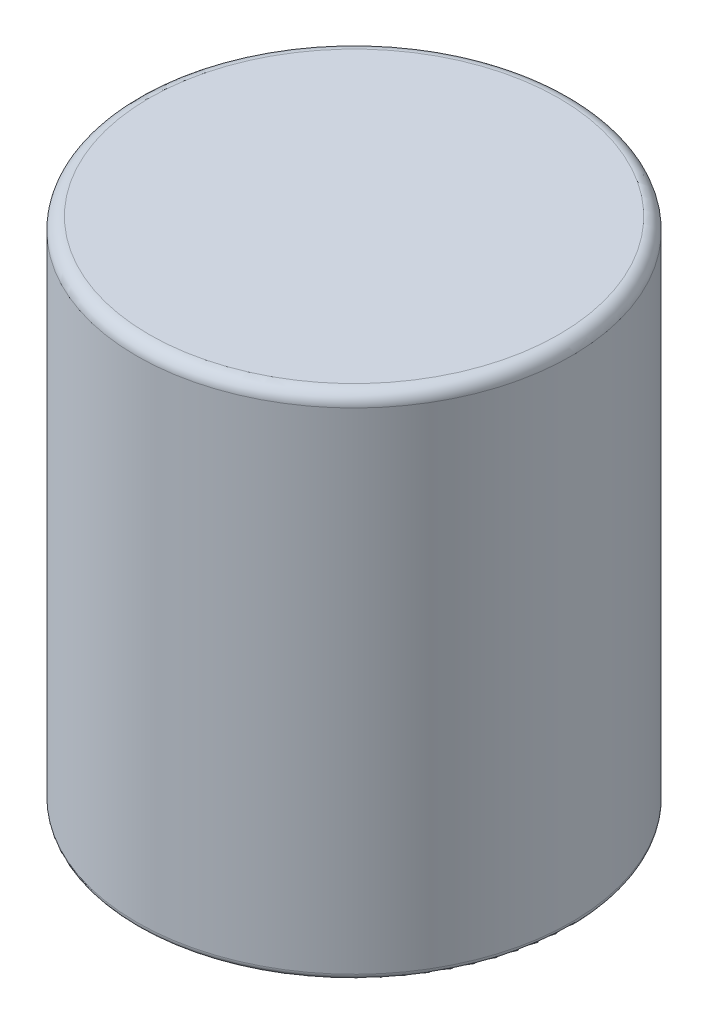
ISO-10303-21;
HEADER;
FILE_DESCRIPTION(('STEP AP214'),'2;1');
FILE_NAME('part.step','',(''),(''),'','','');
FILE_SCHEMA(('AUTOMOTIVE_DESIGN { 1 0 10303 214 1 1 1 1 }'));
ENDSEC;
DATA;
#1=APPLICATION_CONTEXT('core data for automotive mechanical design processes');
#2=APPLICATION_PROTOCOL_DEFINITION('international standard','automotive_design',2000,#1);
#3=PRODUCT_CONTEXT('',#1,'mechanical');
#4=PRODUCT('Part','Part','',(#3));
#5=PRODUCT_RELATED_PRODUCT_CATEGORY('part','',(#4));
#6=PRODUCT_DEFINITION_FORMATION('','',#4);
#7=PRODUCT_DEFINITION_CONTEXT('part definition',#1,'design');
#8=PRODUCT_DEFINITION('design','',#6,#7);
#9=PRODUCT_DEFINITION_SHAPE('','',#8);
#10=(LENGTH_UNIT() NAMED_UNIT(*) SI_UNIT(.MILLI.,.METRE.));
#11=(NAMED_UNIT(*) PLANE_ANGLE_UNIT() SI_UNIT($,.RADIAN.));
#12=(NAMED_UNIT(*) SI_UNIT($,.STERADIAN.) SOLID_ANGLE_UNIT());
#13=UNCERTAINTY_MEASURE_WITH_UNIT(LENGTH_MEASURE(1.E-05),#10,'distance_accuracy_value','');
#14=(GEOMETRIC_REPRESENTATION_CONTEXT(3) GLOBAL_UNCERTAINTY_ASSIGNED_CONTEXT((#13)) GLOBAL_UNIT_ASSIGNED_CONTEXT((#10,
#11,#12)) REPRESENTATION_CONTEXT('',''));
#15=CARTESIAN_POINT('',(0.,0.,0.));
#16=DIRECTION('',(0.,0.,1.));
#17=DIRECTION('',(1.,0.,0.));
#18=AXIS2_PLACEMENT_3D('',#15,#16,#17);
#19=CARTESIAN_POINT('',(0.,41.,0.));
#20=DIRECTION('',(0.,-1.,0.));
#21=DIRECTION('',(0.,0.,-1.));
#22=AXIS2_PLACEMENT_3D('',#19,#20,#21);
#23=CYLINDRICAL_SURFACE('',#22,17.5);
#24=CARTESIAN_POINT('',(0.,0.5,0.));
#25=DIRECTION('',(0.,1.,0.));
#26=DIRECTION('',(0.,0.,1.));
#27=AXIS2_PLACEMENT_3D('',#24,#25,#26);
#28=CIRCLE('',#27,17.5);
#29=CARTESIAN_POINT('',(0.,0.5,17.5));
#30=VERTEX_POINT('',#29);
#31=EDGE_CURVE('E45',#30,#30,#28,.T.);
#32=ORIENTED_EDGE('',*,*,#31,.T.);
#33=EDGE_LOOP('',(#32));
#34=FACE_BOUND('',#33,.T.);
#35=CARTESIAN_POINT('',(0.,40.,0.));
#36=DIRECTION('',(0.,1.,0.));
#37=DIRECTION('',(0.,0.,1.));
#38=AXIS2_PLACEMENT_3D('',#35,#36,#37);
#39=CIRCLE('',#38,17.5);
#40=CARTESIAN_POINT('',(0.,40.,17.5));
#41=VERTEX_POINT('',#40);
#42=EDGE_CURVE('E58',#41,#41,#39,.F.);
#43=ORIENTED_EDGE('',*,*,#42,.T.);
#44=EDGE_LOOP('',(#43));
#45=FACE_BOUND('',#44,.T.);
#46=ADVANCED_FACE('F38',(#34,#45),#23,.T.);
#47=CARTESIAN_POINT('',(0.,41.,0.));
#48=DIRECTION('',(0.,1.,0.));
#49=DIRECTION('',(0.,0.,1.));
#50=AXIS2_PLACEMENT_3D('',#47,#48,#49);
#51=PLANE('',#50);
#52=CARTESIAN_POINT('',(0.,41.,0.));
#53=DIRECTION('',(0.,1.,0.));
#54=DIRECTION('',(0.,0.,1.));
#55=AXIS2_PLACEMENT_3D('',#52,#53,#54);
#56=CIRCLE('',#55,16.5);
#57=CARTESIAN_POINT('',(0.,41.,16.5));
#58=VERTEX_POINT('',#57);
#59=EDGE_CURVE('E61',#58,#58,#56,.T.);
#60=ORIENTED_EDGE('',*,*,#59,.T.);
#61=EDGE_LOOP('',(#60));
#62=FACE_BOUND('',#61,.T.);
#63=ADVANCED_FACE('F84',(#62),#51,.T.);
#64=CARTESIAN_POINT('',(0.,0.,0.));
#65=DIRECTION('',(0.,1.,0.));
#66=DIRECTION('',(0.,0.,1.));
#67=AXIS2_PLACEMENT_3D('',#64,#65,#66);
#68=PLANE('',#67);
#69=CARTESIAN_POINT('',(0.,0.,0.));
#70=DIRECTION('',(0.,1.,0.));
#71=DIRECTION('',(0.,0.,1.));
#72=AXIS2_PLACEMENT_3D('',#69,#70,#71);
#73=CIRCLE('',#72,17.);
#74=CARTESIAN_POINT('',(0.,0.,17.));
#75=VERTEX_POINT('',#74);
#76=EDGE_CURVE('E10',#75,#75,#73,.F.);
#77=ORIENTED_EDGE('',*,*,#76,.T.);
#78=EDGE_LOOP('',(#77));
#79=FACE_BOUND('',#78,.T.);
#80=CARTESIAN_POINT('',(0.,0.,-5.));
#81=DIRECTION('',(0.,1.,0.));
#82=DIRECTION('',(0.,0.,1.));
#83=AXIS2_PLACEMENT_3D('',#80,#81,#82);
#84=CIRCLE('',#83,0.6);
#85=CARTESIAN_POINT('',(0.,0.,-4.4));
#86=VERTEX_POINT('',#85);
#87=EDGE_CURVE('E49',#86,#86,#84,.F.);
#88=ORIENTED_EDGE('',*,*,#87,.F.);
#89=EDGE_LOOP('',(#88));
#90=FACE_BOUND('',#89,.T.);
#91=CARTESIAN_POINT('',(0.,0.,5.));
#92=DIRECTION('',(0.,1.,0.));
#93=DIRECTION('',(0.,0.,1.));
#94=AXIS2_PLACEMENT_3D('',#91,#92,#93);
#95=CIRCLE('',#94,0.6);
#96=CARTESIAN_POINT('',(0.,0.,5.6));
#97=VERTEX_POINT('',#96);
#98=EDGE_CURVE('E53',#97,#97,#95,.F.);
#99=ORIENTED_EDGE('',*,*,#98,.F.);
#100=EDGE_LOOP('',(#99));
#101=FACE_BOUND('',#100,.T.);
#102=ADVANCED_FACE('F80',(#79,#90,#101),#68,.F.);
#103=CARTESIAN_POINT('',(0.,40.,0.));
#104=DIRECTION('',(0.,1.,0.));
#105=DIRECTION('',(0.,0.,1.));
#106=AXIS2_PLACEMENT_3D('',#103,#104,#105);
#107=TOROIDAL_SURFACE('',#106,16.5,1.);
#108=ORIENTED_EDGE('',*,*,#42,.F.);
#109=EDGE_LOOP('',(#108));
#110=FACE_BOUND('',#109,.T.);
#111=ORIENTED_EDGE('',*,*,#59,.F.);
#112=EDGE_LOOP('',(#111));
#113=FACE_BOUND('',#112,.T.);
#114=ADVANCED_FACE('F83',(#110,#113),#107,.T.);
#115=CARTESIAN_POINT('',(0.,-5.,5.));
#116=DIRECTION('',(0.,1.,0.));
#117=DIRECTION('',(0.,0.,1.));
#118=AXIS2_PLACEMENT_3D('',#115,#116,#117);
#119=CYLINDRICAL_SURFACE('',#118,0.6);
#120=CARTESIAN_POINT('',(0.,-5.,5.));
#121=DIRECTION('',(0.,-1.,0.));
#122=DIRECTION('',(0.,0.,-1.));
#123=AXIS2_PLACEMENT_3D('',#120,#121,#122);
#124=CIRCLE('',#123,0.6);
#125=CARTESIAN_POINT('',(0.,-5.,4.4));
#126=VERTEX_POINT('',#125);
#127=EDGE_CURVE('E64',#126,#126,#124,.T.);
#128=ORIENTED_EDGE('',*,*,#127,.F.);
#129=EDGE_LOOP('',(#128));
#130=FACE_BOUND('',#129,.T.);
#131=ORIENTED_EDGE('',*,*,#98,.T.);
#132=EDGE_LOOP('',(#131));
#133=FACE_BOUND('',#132,.T.);
#134=ADVANCED_FACE('F88',(#130,#133),#119,.T.);
#135=CARTESIAN_POINT('',(0.,-5.,5.));
#136=DIRECTION('',(0.,-1.,0.));
#137=DIRECTION('',(0.,0.,-1.));
#138=AXIS2_PLACEMENT_3D('',#135,#136,#137);
#139=PLANE('',#138);
#140=ORIENTED_EDGE('',*,*,#127,.T.);
#141=EDGE_LOOP('',(#140));
#142=FACE_BOUND('',#141,.T.);
#143=ADVANCED_FACE('F76',(#142),#139,.T.);
#144=CARTESIAN_POINT('',(0.,-5.,-5.));
#145=DIRECTION('',(0.,1.,0.));
#146=DIRECTION('',(0.,0.,1.));
#147=AXIS2_PLACEMENT_3D('',#144,#145,#146);
#148=CYLINDRICAL_SURFACE('',#147,0.6);
#149=CARTESIAN_POINT('',(0.,-5.,-5.));
#150=DIRECTION('',(0.,-1.,0.));
#151=DIRECTION('',(0.,0.,-1.));
#152=AXIS2_PLACEMENT_3D('',#149,#150,#151);
#153=CIRCLE('',#152,0.6);
#154=CARTESIAN_POINT('',(0.,-5.,-5.6));
#155=VERTEX_POINT('',#154);
#156=EDGE_CURVE('E67',#155,#155,#153,.T.);
#157=ORIENTED_EDGE('',*,*,#156,.F.);
#158=EDGE_LOOP('',(#157));
#159=FACE_BOUND('',#158,.T.);
#160=ORIENTED_EDGE('',*,*,#87,.T.);
#161=EDGE_LOOP('',(#160));
#162=FACE_BOUND('',#161,.T.);
#163=ADVANCED_FACE('F73',(#159,#162),#148,.T.);
#164=CARTESIAN_POINT('',(0.,-5.,-5.));
#165=DIRECTION('',(0.,-1.,0.));
#166=DIRECTION('',(0.,0.,-1.));
#167=AXIS2_PLACEMENT_3D('',#164,#165,#166);
#168=PLANE('',#167);
#169=ORIENTED_EDGE('',*,*,#156,.T.);
#170=EDGE_LOOP('',(#169));
#171=FACE_BOUND('',#170,.T.);
#172=ADVANCED_FACE('F71',(#171),#168,.T.);
#173=CARTESIAN_POINT('',(0.,0.5,0.));
#174=DIRECTION('',(0.,1.,0.));
#175=DIRECTION('',(0.,0.,1.));
#176=AXIS2_PLACEMENT_3D('',#173,#174,#175);
#177=TOROIDAL_SURFACE('',#176,17.,0.5);
#178=ORIENTED_EDGE('',*,*,#76,.F.);
#179=EDGE_LOOP('',(#178));
#180=FACE_BOUND('',#179,.T.);
#181=ORIENTED_EDGE('',*,*,#31,.F.);
#182=EDGE_LOOP('',(#181));
#183=FACE_BOUND('',#182,.T.);
#184=ADVANCED_FACE('F40',(#180,#183),#177,.T.);
#185=CLOSED_SHELL('',(#46,#63,#102,#114,#134,#143,#163,#172,#184));
#186=MANIFOLD_SOLID_BREP('B2',#185);
#187=ADVANCED_BREP_SHAPE_REPRESENTATION('',(#18,#186),#14);
#188=SHAPE_DEFINITION_REPRESENTATION(#9,#187);
ENDSEC;
END-ISO-10303-21;
